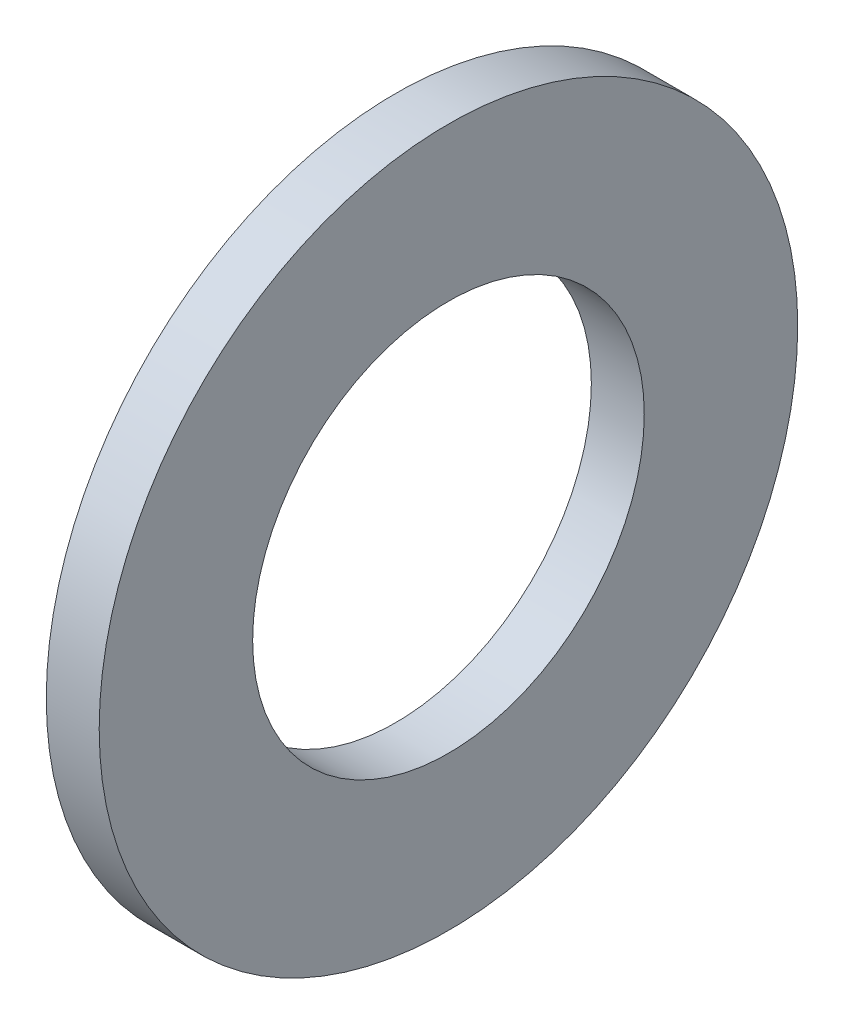
ISO-10303-21;
HEADER;
FILE_DESCRIPTION(('STEP AP214'),'2;1');
FILE_NAME('part.step','',(''),(''),'','','');
FILE_SCHEMA(('AUTOMOTIVE_DESIGN { 1 0 10303 214 1 1 1 1 }'));
ENDSEC;
DATA;
#1=APPLICATION_CONTEXT('core data for automotive mechanical design processes');
#2=APPLICATION_PROTOCOL_DEFINITION('international standard','automotive_design',2000,#1);
#3=PRODUCT_CONTEXT('',#1,'mechanical');
#4=PRODUCT('Part','Part','',(#3));
#5=PRODUCT_RELATED_PRODUCT_CATEGORY('part','',(#4));
#6=PRODUCT_DEFINITION_FORMATION('','',#4);
#7=PRODUCT_DEFINITION_CONTEXT('part definition',#1,'design');
#8=PRODUCT_DEFINITION('design','',#6,#7);
#9=PRODUCT_DEFINITION_SHAPE('','',#8);
#10=(LENGTH_UNIT() NAMED_UNIT(*) SI_UNIT(.MILLI.,.METRE.));
#11=(NAMED_UNIT(*) PLANE_ANGLE_UNIT() SI_UNIT($,.RADIAN.));
#12=(NAMED_UNIT(*) SI_UNIT($,.STERADIAN.) SOLID_ANGLE_UNIT());
#13=UNCERTAINTY_MEASURE_WITH_UNIT(LENGTH_MEASURE(1.E-05),#10,'distance_accuracy_value','');
#14=(GEOMETRIC_REPRESENTATION_CONTEXT(3) GLOBAL_UNCERTAINTY_ASSIGNED_CONTEXT((#13)) GLOBAL_UNIT_ASSIGNED_CONTEXT((#10,
#11,#12)) REPRESENTATION_CONTEXT('',''));
#15=CARTESIAN_POINT('',(0.,0.,0.));
#16=DIRECTION('',(0.,0.,1.));
#17=DIRECTION('',(1.,0.,0.));
#18=AXIS2_PLACEMENT_3D('',#15,#16,#17);
#19=CARTESIAN_POINT('',(-34.9249999999999,0.,0.));
#20=DIRECTION('',(-1.,0.,0.));
#21=DIRECTION('',(0.,0.,1.));
#22=AXIS2_PLACEMENT_3D('',#19,#20,#21);
#23=CYLINDRICAL_SURFACE('',#22,18.5);
#24=CARTESIAN_POINT('',(0.,0.,0.));
#25=DIRECTION('',(-1.,0.,0.));
#26=DIRECTION('',(0.,0.,1.));
#27=AXIS2_PLACEMENT_3D('',#24,#25,#26);
#28=CIRCLE('',#27,18.5);
#29=CARTESIAN_POINT('',(0.,0.,18.5));
#30=VERTEX_POINT('',#29);
#31=EDGE_CURVE('E10',#30,#30,#28,.T.);
#32=ORIENTED_EDGE('',*,*,#31,.F.);
#33=EDGE_LOOP('',(#32));
#34=FACE_BOUND('',#33,.T.);
#35=CARTESIAN_POINT('',(-5.,0.,0.));
#36=DIRECTION('',(-1.,0.,0.));
#37=DIRECTION('',(0.,0.,1.));
#38=AXIS2_PLACEMENT_3D('',#35,#36,#37);
#39=CIRCLE('',#38,18.5);
#40=CARTESIAN_POINT('',(-5.,0.,18.5));
#41=VERTEX_POINT('',#40);
#42=EDGE_CURVE('E49',#41,#41,#39,.T.);
#43=ORIENTED_EDGE('',*,*,#42,.T.);
#44=EDGE_LOOP('',(#43));
#45=FACE_BOUND('',#44,.T.);
#46=ADVANCED_FACE('F38',(#34,#45),#23,.F.);
#47=CARTESIAN_POINT('',(0.,18.5,0.));
#48=DIRECTION('',(-1.,0.,0.));
#49=DIRECTION('',(0.,0.,1.));
#50=AXIS2_PLACEMENT_3D('',#47,#48,#49);
#51=PLANE('',#50);
#52=CARTESIAN_POINT('',(0.,0.,0.));
#53=DIRECTION('',(-1.,0.,0.));
#54=DIRECTION('',(0.,0.,1.));
#55=AXIS2_PLACEMENT_3D('',#52,#53,#54);
#56=CIRCLE('',#55,33.);
#57=CARTESIAN_POINT('',(0.,0.,33.));
#58=VERTEX_POINT('',#57);
#59=EDGE_CURVE('E45',#58,#58,#56,.T.);
#60=ORIENTED_EDGE('',*,*,#59,.F.);
#61=EDGE_LOOP('',(#60));
#62=FACE_BOUND('',#61,.T.);
#63=ORIENTED_EDGE('',*,*,#31,.T.);
#64=EDGE_LOOP('',(#63));
#65=FACE_BOUND('',#64,.T.);
#66=ADVANCED_FACE('F63',(#62,#65),#51,.F.);
#67=CARTESIAN_POINT('',(-34.9249999999999,0.,0.));
#68=DIRECTION('',(-1.,0.,0.));
#69=DIRECTION('',(0.,0.,1.));
#70=AXIS2_PLACEMENT_3D('',#67,#68,#69);
#71=CYLINDRICAL_SURFACE('',#70,33.);
#72=CARTESIAN_POINT('',(-5.,0.,0.));
#73=DIRECTION('',(-1.,0.,0.));
#74=DIRECTION('',(0.,0.,1.));
#75=AXIS2_PLACEMENT_3D('',#72,#73,#74);
#76=CIRCLE('',#75,33.);
#77=CARTESIAN_POINT('',(-5.,0.,33.));
#78=VERTEX_POINT('',#77);
#79=EDGE_CURVE('E46',#78,#78,#76,.T.);
#80=ORIENTED_EDGE('',*,*,#79,.F.);
#81=EDGE_LOOP('',(#80));
#82=FACE_BOUND('',#81,.T.);
#83=ORIENTED_EDGE('',*,*,#59,.T.);
#84=EDGE_LOOP('',(#83));
#85=FACE_BOUND('',#84,.T.);
#86=ADVANCED_FACE('F58',(#82,#85),#71,.T.);
#87=CARTESIAN_POINT('',(-5.,33.,0.));
#88=DIRECTION('',(1.,0.,0.));
#89=DIRECTION('',(0.,0.,-1.));
#90=AXIS2_PLACEMENT_3D('',#87,#88,#89);
#91=PLANE('',#90);
#92=ORIENTED_EDGE('',*,*,#42,.F.);
#93=EDGE_LOOP('',(#92));
#94=FACE_BOUND('',#93,.T.);
#95=ORIENTED_EDGE('',*,*,#79,.T.);
#96=EDGE_LOOP('',(#95));
#97=FACE_BOUND('',#96,.T.);
#98=ADVANCED_FACE('F60',(#94,#97),#91,.F.);
#99=CLOSED_SHELL('',(#46,#66,#86,#98));
#100=MANIFOLD_SOLID_BREP('B2',#99);
#101=ADVANCED_BREP_SHAPE_REPRESENTATION('',(#18,#100),#14);
#102=SHAPE_DEFINITION_REPRESENTATION(#9,#101);
ENDSEC;
END-ISO-10303-21;
